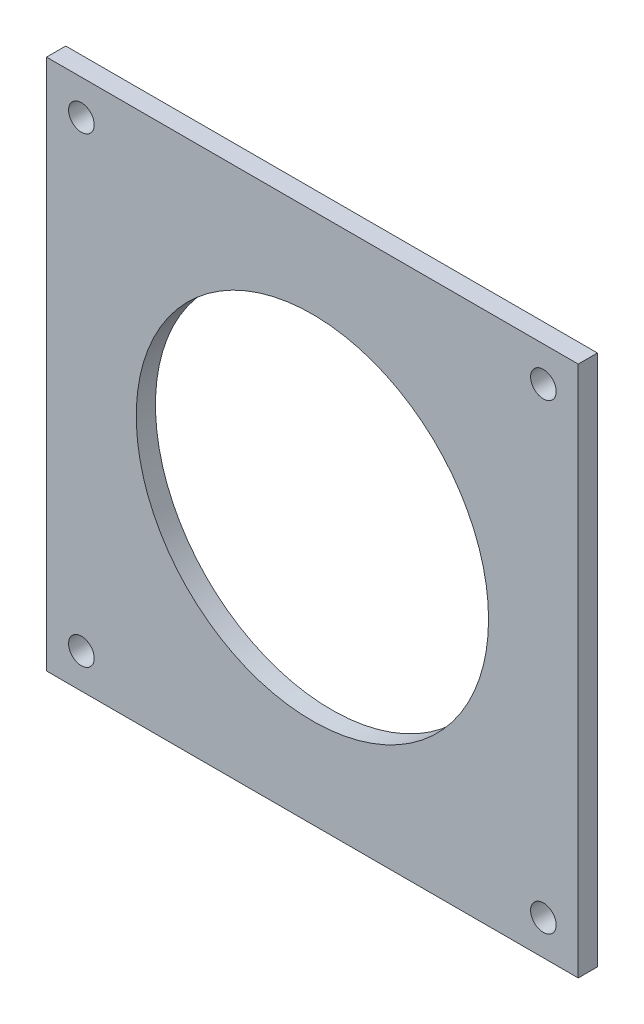
ISO-10303-21;
HEADER;
FILE_DESCRIPTION(('STEP AP214'),'2;1');
FILE_NAME('part.step','',(''),(''),'','','');
FILE_SCHEMA(('AUTOMOTIVE_DESIGN { 1 0 10303 214 1 1 1 1 }'));
ENDSEC;
DATA;
#1=APPLICATION_CONTEXT('core data for automotive mechanical design processes');
#2=APPLICATION_PROTOCOL_DEFINITION('international standard','automotive_design',2000,#1);
#3=PRODUCT_CONTEXT('',#1,'mechanical');
#4=PRODUCT('Part','Part','',(#3));
#5=PRODUCT_RELATED_PRODUCT_CATEGORY('part','',(#4));
#6=PRODUCT_DEFINITION_FORMATION('','',#4);
#7=PRODUCT_DEFINITION_CONTEXT('part definition',#1,'design');
#8=PRODUCT_DEFINITION('design','',#6,#7);
#9=PRODUCT_DEFINITION_SHAPE('','',#8);
#10=(LENGTH_UNIT() NAMED_UNIT(*) SI_UNIT(.MILLI.,.METRE.));
#11=(NAMED_UNIT(*) PLANE_ANGLE_UNIT() SI_UNIT($,.RADIAN.));
#12=(NAMED_UNIT(*) SI_UNIT($,.STERADIAN.) SOLID_ANGLE_UNIT());
#13=UNCERTAINTY_MEASURE_WITH_UNIT(LENGTH_MEASURE(1.E-05),#10,'distance_accuracy_value','');
#14=(GEOMETRIC_REPRESENTATION_CONTEXT(3) GLOBAL_UNCERTAINTY_ASSIGNED_CONTEXT((#13)) GLOBAL_UNIT_ASSIGNED_CONTEXT((#10,
#11,#12)) REPRESENTATION_CONTEXT('',''));
#15=CARTESIAN_POINT('',(0.,0.,0.));
#16=DIRECTION('',(0.,0.,1.));
#17=DIRECTION('',(1.,0.,0.));
#18=AXIS2_PLACEMENT_3D('',#15,#16,#17);
#19=CARTESIAN_POINT('',(0.,0.,3.));
#20=DIRECTION('',(0.,0.,1.));
#21=DIRECTION('',(1.,0.,0.));
#22=AXIS2_PLACEMENT_3D('',#19,#20,#21);
#23=PLANE('',#22);
#24=CARTESIAN_POINT('',(-36.0624458405139,36.0624458405139,3.));
#25=DIRECTION('',(0.,0.,1.));
#26=DIRECTION('',(1.,0.,0.));
#27=AXIS2_PLACEMENT_3D('',#24,#25,#26);
#28=CIRCLE('',#27,2.);
#29=CARTESIAN_POINT('',(-34.0624458405139,36.0624458405139,3.));
#30=VERTEX_POINT('',#29);
#31=EDGE_CURVE('E133',#30,#30,#28,.T.);
#32=ORIENTED_EDGE('',*,*,#31,.F.);
#33=EDGE_LOOP('',(#32));
#34=FACE_BOUND('',#33,.T.);
#35=CARTESIAN_POINT('',(36.0624458405139,-36.0624458405139,3.));
#36=DIRECTION('',(0.,0.,1.));
#37=DIRECTION('',(1.,0.,0.));
#38=AXIS2_PLACEMENT_3D('',#35,#36,#37);
#39=CIRCLE('',#38,2.);
#40=CARTESIAN_POINT('',(38.0624458405139,-36.0624458405139,3.));
#41=VERTEX_POINT('',#40);
#42=EDGE_CURVE('E121',#41,#41,#39,.T.);
#43=ORIENTED_EDGE('',*,*,#42,.F.);
#44=EDGE_LOOP('',(#43));
#45=FACE_BOUND('',#44,.T.);
#46=DIRECTION('',(1.,0.,0.));
#47=VECTOR('',#46,1.);
#48=CARTESIAN_POINT('',(-41.5,-41.5,3.));
#49=LINE('',#48,#47);
#50=CARTESIAN_POINT('',(-41.5,-41.5,3.));
#51=VERTEX_POINT('',#50);
#52=CARTESIAN_POINT('',(41.5,-41.5,3.));
#53=VERTEX_POINT('',#52);
#54=EDGE_CURVE('E91',#51,#53,#49,.T.);
#55=ORIENTED_EDGE('',*,*,#54,.T.);
#56=DIRECTION('',(0.,1.,0.));
#57=VECTOR('',#56,1.);
#58=CARTESIAN_POINT('',(41.5,-41.5,3.));
#59=LINE('',#58,#57);
#60=CARTESIAN_POINT('',(41.5,41.5,3.));
#61=VERTEX_POINT('',#60);
#62=EDGE_CURVE('E86',#53,#61,#59,.T.);
#63=ORIENTED_EDGE('',*,*,#62,.T.);
#64=DIRECTION('',(-1.,0.,0.));
#65=VECTOR('',#64,1.);
#66=CARTESIAN_POINT('',(41.5,41.5,3.));
#67=LINE('',#66,#65);
#68=CARTESIAN_POINT('',(-41.5,41.5,3.));
#69=VERTEX_POINT('',#68);
#70=EDGE_CURVE('E89',#61,#69,#67,.T.);
#71=ORIENTED_EDGE('',*,*,#70,.T.);
#72=DIRECTION('',(0.,-1.,0.));
#73=VECTOR('',#72,1.);
#74=CARTESIAN_POINT('',(-41.5,41.5,3.));
#75=LINE('',#74,#73);
#76=EDGE_CURVE('E56',#69,#51,#75,.T.);
#77=ORIENTED_EDGE('',*,*,#76,.T.);
#78=EDGE_LOOP('',(#55,#63,#71,#77));
#79=FACE_BOUND('',#78,.T.);
#80=CARTESIAN_POINT('',(36.0624458405139,36.0624458405139,3.));
#81=DIRECTION('',(0.,0.,1.));
#82=DIRECTION('',(1.,0.,0.));
#83=AXIS2_PLACEMENT_3D('',#80,#81,#82);
#84=CIRCLE('',#83,2.);
#85=CARTESIAN_POINT('',(38.0624458405139,36.0624458405139,3.));
#86=VERTEX_POINT('',#85);
#87=EDGE_CURVE('E106',#86,#86,#84,.T.);
#88=ORIENTED_EDGE('',*,*,#87,.F.);
#89=EDGE_LOOP('',(#88));
#90=FACE_BOUND('',#89,.T.);
#91=CARTESIAN_POINT('',(0.,0.,3.));
#92=DIRECTION('',(0.,0.,1.));
#93=DIRECTION('',(1.,0.,0.));
#94=AXIS2_PLACEMENT_3D('',#91,#92,#93);
#95=CIRCLE('',#94,27.5);
#96=CARTESIAN_POINT('',(27.5,0.,3.));
#97=VERTEX_POINT('',#96);
#98=EDGE_CURVE('E127',#97,#97,#95,.T.);
#99=ORIENTED_EDGE('',*,*,#98,.F.);
#100=EDGE_LOOP('',(#99));
#101=FACE_BOUND('',#100,.T.);
#102=CARTESIAN_POINT('',(-36.0624458405139,-36.0624458405139,3.));
#103=DIRECTION('',(0.,0.,1.));
#104=DIRECTION('',(1.,0.,0.));
#105=AXIS2_PLACEMENT_3D('',#102,#103,#104);
#106=CIRCLE('',#105,2.);
#107=CARTESIAN_POINT('',(-34.0624458405139,-36.0624458405139,3.));
#108=VERTEX_POINT('',#107);
#109=EDGE_CURVE('E139',#108,#108,#106,.T.);
#110=ORIENTED_EDGE('',*,*,#109,.F.);
#111=EDGE_LOOP('',(#110));
#112=FACE_BOUND('',#111,.T.);
#113=ADVANCED_FACE('F39',(#34,#45,#79,#90,#101,#112),#23,.T.);
#114=CARTESIAN_POINT('',(0.,0.,0.));
#115=DIRECTION('',(0.,0.,1.));
#116=DIRECTION('',(1.,0.,0.));
#117=AXIS2_PLACEMENT_3D('',#114,#115,#116);
#118=PLANE('',#117);
#119=DIRECTION('',(1.,0.,0.));
#120=VECTOR('',#119,1.);
#121=CARTESIAN_POINT('',(-41.5,-41.5,0.));
#122=LINE('',#121,#120);
#123=CARTESIAN_POINT('',(-41.5,-41.5,0.));
#124=VERTEX_POINT('',#123);
#125=CARTESIAN_POINT('',(41.5,-41.5,0.));
#126=VERTEX_POINT('',#125);
#127=EDGE_CURVE('E103',#124,#126,#122,.T.);
#128=ORIENTED_EDGE('',*,*,#127,.F.);
#129=DIRECTION('',(0.,-1.,0.));
#130=VECTOR('',#129,1.);
#131=CARTESIAN_POINT('',(-41.5,41.5,0.));
#132=LINE('',#131,#130);
#133=CARTESIAN_POINT('',(-41.5,41.5,0.));
#134=VERTEX_POINT('',#133);
#135=EDGE_CURVE('E79',#134,#124,#132,.T.);
#136=ORIENTED_EDGE('',*,*,#135,.F.);
#137=DIRECTION('',(-1.,0.,0.));
#138=VECTOR('',#137,1.);
#139=CARTESIAN_POINT('',(41.5,41.5,0.));
#140=LINE('',#139,#138);
#141=CARTESIAN_POINT('',(41.5,41.5,0.));
#142=VERTEX_POINT('',#141);
#143=EDGE_CURVE('E73',#142,#134,#140,.T.);
#144=ORIENTED_EDGE('',*,*,#143,.F.);
#145=DIRECTION('',(0.,1.,0.));
#146=VECTOR('',#145,1.);
#147=CARTESIAN_POINT('',(41.5,-41.5,0.));
#148=LINE('',#147,#146);
#149=EDGE_CURVE('E95',#126,#142,#148,.T.);
#150=ORIENTED_EDGE('',*,*,#149,.F.);
#151=EDGE_LOOP('',(#128,#136,#144,#150));
#152=FACE_BOUND('',#151,.T.);
#153=CARTESIAN_POINT('',(36.0624458405139,36.0624458405139,0.));
#154=DIRECTION('',(0.,0.,1.));
#155=DIRECTION('',(1.,0.,0.));
#156=AXIS2_PLACEMENT_3D('',#153,#154,#155);
#157=CIRCLE('',#156,2.);
#158=CARTESIAN_POINT('',(38.0624458405139,36.0624458405139,0.));
#159=VERTEX_POINT('',#158);
#160=EDGE_CURVE('E118',#159,#159,#157,.T.);
#161=ORIENTED_EDGE('',*,*,#160,.T.);
#162=EDGE_LOOP('',(#161));
#163=FACE_BOUND('',#162,.T.);
#164=CARTESIAN_POINT('',(36.0624458405139,-36.0624458405139,0.));
#165=DIRECTION('',(0.,0.,1.));
#166=DIRECTION('',(1.,0.,0.));
#167=AXIS2_PLACEMENT_3D('',#164,#165,#166);
#168=CIRCLE('',#167,2.);
#169=CARTESIAN_POINT('',(38.0624458405139,-36.0624458405139,0.));
#170=VERTEX_POINT('',#169);
#171=EDGE_CURVE('E124',#170,#170,#168,.T.);
#172=ORIENTED_EDGE('',*,*,#171,.T.);
#173=EDGE_LOOP('',(#172));
#174=FACE_BOUND('',#173,.T.);
#175=CARTESIAN_POINT('',(0.,0.,0.));
#176=DIRECTION('',(0.,0.,1.));
#177=DIRECTION('',(1.,0.,0.));
#178=AXIS2_PLACEMENT_3D('',#175,#176,#177);
#179=CIRCLE('',#178,27.5);
#180=CARTESIAN_POINT('',(27.5,0.,0.));
#181=VERTEX_POINT('',#180);
#182=EDGE_CURVE('E130',#181,#181,#179,.T.);
#183=ORIENTED_EDGE('',*,*,#182,.T.);
#184=EDGE_LOOP('',(#183));
#185=FACE_BOUND('',#184,.T.);
#186=CARTESIAN_POINT('',(-36.0624458405139,36.0624458405139,0.));
#187=DIRECTION('',(0.,0.,1.));
#188=DIRECTION('',(1.,0.,0.));
#189=AXIS2_PLACEMENT_3D('',#186,#187,#188);
#190=CIRCLE('',#189,2.);
#191=CARTESIAN_POINT('',(-34.0624458405139,36.0624458405139,0.));
#192=VERTEX_POINT('',#191);
#193=EDGE_CURVE('E136',#192,#192,#190,.T.);
#194=ORIENTED_EDGE('',*,*,#193,.T.);
#195=EDGE_LOOP('',(#194));
#196=FACE_BOUND('',#195,.T.);
#197=CARTESIAN_POINT('',(-36.0624458405139,-36.0624458405139,0.));
#198=DIRECTION('',(0.,0.,1.));
#199=DIRECTION('',(1.,0.,0.));
#200=AXIS2_PLACEMENT_3D('',#197,#198,#199);
#201=CIRCLE('',#200,2.);
#202=CARTESIAN_POINT('',(-34.0624458405139,-36.0624458405139,0.));
#203=VERTEX_POINT('',#202);
#204=EDGE_CURVE('E142',#203,#203,#201,.T.);
#205=ORIENTED_EDGE('',*,*,#204,.T.);
#206=EDGE_LOOP('',(#205));
#207=FACE_BOUND('',#206,.T.);
#208=ADVANCED_FACE('F114',(#152,#163,#174,#185,#196,#207),#118,.F.);
#209=CARTESIAN_POINT('',(-41.5,-41.5,3.));
#210=DIRECTION('',(0.,1.,0.));
#211=DIRECTION('',(0.,0.,1.));
#212=AXIS2_PLACEMENT_3D('',#209,#210,#211);
#213=PLANE('',#212);
#214=ORIENTED_EDGE('',*,*,#127,.T.);
#215=DIRECTION('',(0.,0.,-1.));
#216=VECTOR('',#215,1.);
#217=CARTESIAN_POINT('',(41.5,-41.5,3.));
#218=LINE('',#217,#216);
#219=EDGE_CURVE('E11',#53,#126,#218,.T.);
#220=ORIENTED_EDGE('',*,*,#219,.F.);
#221=ORIENTED_EDGE('',*,*,#54,.F.);
#222=DIRECTION('',(0.,0.,-1.));
#223=VECTOR('',#222,1.);
#224=CARTESIAN_POINT('',(-41.5,-41.5,3.));
#225=LINE('',#224,#223);
#226=EDGE_CURVE('E99',#51,#124,#225,.T.);
#227=ORIENTED_EDGE('',*,*,#226,.T.);
#228=EDGE_LOOP('',(#214,#220,#221,#227));
#229=FACE_BOUND('',#228,.T.);
#230=ADVANCED_FACE('F41',(#229),#213,.F.);
#231=CARTESIAN_POINT('',(41.5,-41.5,3.));
#232=DIRECTION('',(-1.,0.,0.));
#233=DIRECTION('',(0.,0.,1.));
#234=AXIS2_PLACEMENT_3D('',#231,#232,#233);
#235=PLANE('',#234);
#236=ORIENTED_EDGE('',*,*,#149,.T.);
#237=DIRECTION('',(0.,0.,-1.));
#238=VECTOR('',#237,1.);
#239=CARTESIAN_POINT('',(41.5,41.5,3.));
#240=LINE('',#239,#238);
#241=EDGE_CURVE('E48',#61,#142,#240,.T.);
#242=ORIENTED_EDGE('',*,*,#241,.F.);
#243=ORIENTED_EDGE('',*,*,#62,.F.);
#244=ORIENTED_EDGE('',*,*,#219,.T.);
#245=EDGE_LOOP('',(#236,#242,#243,#244));
#246=FACE_BOUND('',#245,.T.);
#247=ADVANCED_FACE('F94',(#246),#235,.F.);
#248=CARTESIAN_POINT('',(41.5,41.5,3.));
#249=DIRECTION('',(0.,-1.,0.));
#250=DIRECTION('',(0.,0.,-1.));
#251=AXIS2_PLACEMENT_3D('',#248,#249,#250);
#252=PLANE('',#251);
#253=ORIENTED_EDGE('',*,*,#143,.T.);
#254=DIRECTION('',(0.,0.,-1.));
#255=VECTOR('',#254,1.);
#256=CARTESIAN_POINT('',(-41.5,41.5,3.));
#257=LINE('',#256,#255);
#258=EDGE_CURVE('E96',#69,#134,#257,.T.);
#259=ORIENTED_EDGE('',*,*,#258,.F.);
#260=ORIENTED_EDGE('',*,*,#70,.F.);
#261=ORIENTED_EDGE('',*,*,#241,.T.);
#262=EDGE_LOOP('',(#253,#259,#260,#261));
#263=FACE_BOUND('',#262,.T.);
#264=ADVANCED_FACE('F97',(#263),#252,.F.);
#265=CARTESIAN_POINT('',(-41.5,41.5,3.));
#266=DIRECTION('',(1.,0.,0.));
#267=DIRECTION('',(0.,1.,0.));
#268=AXIS2_PLACEMENT_3D('',#265,#266,#267);
#269=PLANE('',#268);
#270=ORIENTED_EDGE('',*,*,#135,.T.);
#271=ORIENTED_EDGE('',*,*,#226,.F.);
#272=ORIENTED_EDGE('',*,*,#76,.F.);
#273=ORIENTED_EDGE('',*,*,#258,.T.);
#274=EDGE_LOOP('',(#270,#271,#272,#273));
#275=FACE_BOUND('',#274,.T.);
#276=ADVANCED_FACE('F111',(#275),#269,.F.);
#277=CARTESIAN_POINT('',(36.0624458405139,36.0624458405139,3.));
#278=DIRECTION('',(0.,0.,-1.));
#279=DIRECTION('',(-1.,0.,0.));
#280=AXIS2_PLACEMENT_3D('',#277,#278,#279);
#281=CYLINDRICAL_SURFACE('',#280,2.);
#282=ORIENTED_EDGE('',*,*,#87,.T.);
#283=EDGE_LOOP('',(#282));
#284=FACE_BOUND('',#283,.T.);
#285=ORIENTED_EDGE('',*,*,#160,.F.);
#286=EDGE_LOOP('',(#285));
#287=FACE_BOUND('',#286,.T.);
#288=ADVANCED_FACE('F161',(#284,#287),#281,.F.);
#289=CARTESIAN_POINT('',(36.0624458405139,-36.0624458405139,3.));
#290=DIRECTION('',(0.,0.,-1.));
#291=DIRECTION('',(-1.,0.,0.));
#292=AXIS2_PLACEMENT_3D('',#289,#290,#291);
#293=CYLINDRICAL_SURFACE('',#292,2.);
#294=ORIENTED_EDGE('',*,*,#42,.T.);
#295=EDGE_LOOP('',(#294));
#296=FACE_BOUND('',#295,.T.);
#297=ORIENTED_EDGE('',*,*,#171,.F.);
#298=EDGE_LOOP('',(#297));
#299=FACE_BOUND('',#298,.T.);
#300=ADVANCED_FACE('F206',(#296,#299),#293,.F.);
#301=CARTESIAN_POINT('',(0.,0.,3.));
#302=DIRECTION('',(0.,0.,-1.));
#303=DIRECTION('',(-1.,0.,0.));
#304=AXIS2_PLACEMENT_3D('',#301,#302,#303);
#305=CYLINDRICAL_SURFACE('',#304,27.5);
#306=ORIENTED_EDGE('',*,*,#98,.T.);
#307=EDGE_LOOP('',(#306));
#308=FACE_BOUND('',#307,.T.);
#309=ORIENTED_EDGE('',*,*,#182,.F.);
#310=EDGE_LOOP('',(#309));
#311=FACE_BOUND('',#310,.T.);
#312=ADVANCED_FACE('F214',(#308,#311),#305,.F.);
#313=CARTESIAN_POINT('',(-36.0624458405139,36.0624458405139,3.));
#314=DIRECTION('',(0.,0.,-1.));
#315=DIRECTION('',(-1.,0.,0.));
#316=AXIS2_PLACEMENT_3D('',#313,#314,#315);
#317=CYLINDRICAL_SURFACE('',#316,2.);
#318=ORIENTED_EDGE('',*,*,#31,.T.);
#319=EDGE_LOOP('',(#318));
#320=FACE_BOUND('',#319,.T.);
#321=ORIENTED_EDGE('',*,*,#193,.F.);
#322=EDGE_LOOP('',(#321));
#323=FACE_BOUND('',#322,.T.);
#324=ADVANCED_FACE('F222',(#320,#323),#317,.F.);
#325=CARTESIAN_POINT('',(-36.0624458405139,-36.0624458405139,3.));
#326=DIRECTION('',(0.,0.,-1.));
#327=DIRECTION('',(-1.,0.,0.));
#328=AXIS2_PLACEMENT_3D('',#325,#326,#327);
#329=CYLINDRICAL_SURFACE('',#328,2.);
#330=ORIENTED_EDGE('',*,*,#109,.T.);
#331=EDGE_LOOP('',(#330));
#332=FACE_BOUND('',#331,.T.);
#333=ORIENTED_EDGE('',*,*,#204,.F.);
#334=EDGE_LOOP('',(#333));
#335=FACE_BOUND('',#334,.T.);
#336=ADVANCED_FACE('F148',(#332,#335),#329,.F.);
#337=CLOSED_SHELL('',(#113,#208,#230,#247,#264,#276,#288,#300,#312,#324,#336));
#338=MANIFOLD_SOLID_BREP('B2',#337);
#339=ADVANCED_BREP_SHAPE_REPRESENTATION('',(#18,#338),#14);
#340=SHAPE_DEFINITION_REPRESENTATION(#9,#339);
ENDSEC;
END-ISO-10303-21;
